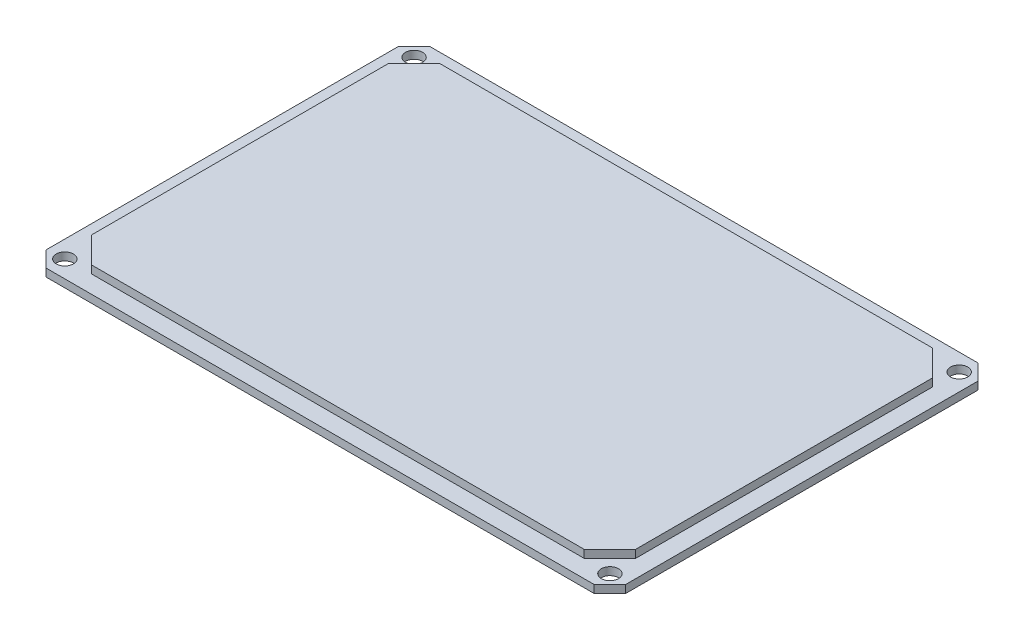
ISO-10303-21;
HEADER;
FILE_DESCRIPTION(('STEP AP214'),'2;1');
FILE_NAME('part.step','',(''),(''),'','','');
FILE_SCHEMA(('AUTOMOTIVE_DESIGN { 1 0 10303 214 1 1 1 1 }'));
ENDSEC;
DATA;
#1=APPLICATION_CONTEXT('core data for automotive mechanical design processes');
#2=APPLICATION_PROTOCOL_DEFINITION('international standard','automotive_design',2000,#1);
#3=PRODUCT_CONTEXT('',#1,'mechanical');
#4=PRODUCT('Part','Part','',(#3));
#5=PRODUCT_RELATED_PRODUCT_CATEGORY('part','',(#4));
#6=PRODUCT_DEFINITION_FORMATION('','',#4);
#7=PRODUCT_DEFINITION_CONTEXT('part definition',#1,'design');
#8=PRODUCT_DEFINITION('design','',#6,#7);
#9=PRODUCT_DEFINITION_SHAPE('','',#8);
#10=(LENGTH_UNIT() NAMED_UNIT(*) SI_UNIT(.MILLI.,.METRE.));
#11=(NAMED_UNIT(*) PLANE_ANGLE_UNIT() SI_UNIT($,.RADIAN.));
#12=(NAMED_UNIT(*) SI_UNIT($,.STERADIAN.) SOLID_ANGLE_UNIT());
#13=UNCERTAINTY_MEASURE_WITH_UNIT(LENGTH_MEASURE(1.E-05),#10,'distance_accuracy_value','');
#14=(GEOMETRIC_REPRESENTATION_CONTEXT(3) GLOBAL_UNCERTAINTY_ASSIGNED_CONTEXT((#13)) GLOBAL_UNIT_ASSIGNED_CONTEXT((#10,
#11,#12)) REPRESENTATION_CONTEXT('',''));
#15=CARTESIAN_POINT('',(0.,0.,0.));
#16=DIRECTION('',(0.,0.,1.));
#17=DIRECTION('',(1.,0.,0.));
#18=AXIS2_PLACEMENT_3D('',#15,#16,#17);
#19=CARTESIAN_POINT('',(0.,1.,0.));
#20=DIRECTION('',(0.,-1.,0.));
#21=DIRECTION('',(0.,0.,-1.));
#22=AXIS2_PLACEMENT_3D('',#19,#20,#21);
#23=PLANE('',#22);
#24=CARTESIAN_POINT('',(34.8,1.,-22.3));
#25=DIRECTION('',(0.,1.,0.));
#26=DIRECTION('',(0.,0.,1.));
#27=AXIS2_PLACEMENT_3D('',#24,#25,#26);
#28=CIRCLE('',#27,1.1);
#29=CARTESIAN_POINT('',(34.8,1.,-21.2));
#30=VERTEX_POINT('',#29);
#31=EDGE_CURVE('E366',#30,#30,#28,.T.);
#32=ORIENTED_EDGE('',*,*,#31,.F.);
#33=EDGE_LOOP('',(#32));
#34=FACE_BOUND('',#33,.T.);
#35=CARTESIAN_POINT('',(34.8,1.,22.3));
#36=DIRECTION('',(0.,1.,0.));
#37=DIRECTION('',(0.,0.,1.));
#38=AXIS2_PLACEMENT_3D('',#35,#36,#37);
#39=CIRCLE('',#38,1.1);
#40=CARTESIAN_POINT('',(34.8,1.,23.4));
#41=VERTEX_POINT('',#40);
#42=EDGE_CURVE('E372',#41,#41,#39,.T.);
#43=ORIENTED_EDGE('',*,*,#42,.F.);
#44=EDGE_LOOP('',(#43));
#45=FACE_BOUND('',#44,.T.);
#46=CARTESIAN_POINT('',(-34.8,1.,22.3));
#47=DIRECTION('',(0.,1.,0.));
#48=DIRECTION('',(0.,0.,1.));
#49=AXIS2_PLACEMENT_3D('',#46,#47,#48);
#50=CIRCLE('',#49,1.1);
#51=CARTESIAN_POINT('',(-34.8,1.,23.4));
#52=VERTEX_POINT('',#51);
#53=EDGE_CURVE('E380',#52,#52,#50,.T.);
#54=ORIENTED_EDGE('',*,*,#53,.F.);
#55=EDGE_LOOP('',(#54));
#56=FACE_BOUND('',#55,.T.);
#57=CARTESIAN_POINT('',(-34.8,1.,-22.3));
#58=DIRECTION('',(0.,1.,0.));
#59=DIRECTION('',(0.,0.,1.));
#60=AXIS2_PLACEMENT_3D('',#57,#58,#59);
#61=CIRCLE('',#60,1.1);
#62=CARTESIAN_POINT('',(-34.8,1.,-21.2));
#63=VERTEX_POINT('',#62);
#64=EDGE_CURVE('E369',#63,#63,#61,.T.);
#65=ORIENTED_EDGE('',*,*,#64,.F.);
#66=EDGE_LOOP('',(#65));
#67=FACE_BOUND('',#66,.T.);
#68=DIRECTION('',(-1.,0.,0.));
#69=VECTOR('',#68,1.);
#70=CARTESIAN_POINT('',(-37.,1.,-24.5));
#71=LINE('',#70,#69);
#72=CARTESIAN_POINT('',(35.,1.,-24.5));
#73=VERTEX_POINT('',#72);
#74=CARTESIAN_POINT('',(-35.,1.,-24.5));
#75=VERTEX_POINT('',#74);
#76=EDGE_CURVE('E281',#73,#75,#71,.T.);
#77=ORIENTED_EDGE('',*,*,#76,.T.);
#78=DIRECTION('',(0.707106781186548,0.,-0.707106781186548));
#79=VECTOR('',#78,1.);
#80=CARTESIAN_POINT('',(-37.,1.,-22.5));
#81=LINE('',#80,#79);
#82=CARTESIAN_POINT('',(-37.,1.,-22.5));
#83=VERTEX_POINT('',#82);
#84=EDGE_CURVE('E196',#75,#83,#81,.F.);
#85=ORIENTED_EDGE('',*,*,#84,.T.);
#86=DIRECTION('',(0.,0.,1.));
#87=VECTOR('',#86,1.);
#88=CARTESIAN_POINT('',(-37.,1.,24.5));
#89=LINE('',#88,#87);
#90=CARTESIAN_POINT('',(-37.,1.,22.5));
#91=VERTEX_POINT('',#90);
#92=EDGE_CURVE('E165',#83,#91,#89,.T.);
#93=ORIENTED_EDGE('',*,*,#92,.T.);
#94=DIRECTION('',(-0.707106781186548,0.,-0.707106781186548));
#95=VECTOR('',#94,1.);
#96=CARTESIAN_POINT('',(-35.,1.,24.5));
#97=LINE('',#96,#95);
#98=CARTESIAN_POINT('',(-35.,1.,24.5));
#99=VERTEX_POINT('',#98);
#100=EDGE_CURVE('E190',#91,#99,#97,.F.);
#101=ORIENTED_EDGE('',*,*,#100,.T.);
#102=DIRECTION('',(1.,0.,0.));
#103=VECTOR('',#102,1.);
#104=CARTESIAN_POINT('',(-37.,1.,24.5));
#105=LINE('',#104,#103);
#106=CARTESIAN_POINT('',(35.,1.,24.5));
#107=VERTEX_POINT('',#106);
#108=EDGE_CURVE('E181',#99,#107,#105,.T.);
#109=ORIENTED_EDGE('',*,*,#108,.T.);
#110=DIRECTION('',(-0.707106781186548,0.,0.707106781186548));
#111=VECTOR('',#110,1.);
#112=CARTESIAN_POINT('',(37.,1.,22.5));
#113=LINE('',#112,#111);
#114=CARTESIAN_POINT('',(37.,1.,22.5));
#115=VERTEX_POINT('',#114);
#116=EDGE_CURVE('E192',#107,#115,#113,.F.);
#117=ORIENTED_EDGE('',*,*,#116,.T.);
#118=DIRECTION('',(0.,0.,-1.));
#119=VECTOR('',#118,1.);
#120=CARTESIAN_POINT('',(37.,1.,24.5));
#121=LINE('',#120,#119);
#122=CARTESIAN_POINT('',(37.,1.,-22.5));
#123=VERTEX_POINT('',#122);
#124=EDGE_CURVE('E175',#115,#123,#121,.T.);
#125=ORIENTED_EDGE('',*,*,#124,.T.);
#126=DIRECTION('',(0.707106781186548,0.,0.707106781186548));
#127=VECTOR('',#126,1.);
#128=CARTESIAN_POINT('',(35.,1.,-24.5));
#129=LINE('',#128,#127);
#130=EDGE_CURVE('E194',#123,#73,#129,.F.);
#131=ORIENTED_EDGE('',*,*,#130,.T.);
#132=EDGE_LOOP('',(#77,#85,#93,#101,#109,#117,#125,#131));
#133=FACE_BOUND('',#132,.T.);
#134=DIRECTION('',(0.,0.,-1.));
#135=VECTOR('',#134,1.);
#136=CARTESIAN_POINT('',(34.75,1.,22.25));
#137=LINE('',#136,#135);
#138=CARTESIAN_POINT('',(34.75,1.,18.95));
#139=VERTEX_POINT('',#138);
#140=CARTESIAN_POINT('',(34.75,1.,-18.95));
#141=VERTEX_POINT('',#140);
#142=EDGE_CURVE('E272',#139,#141,#137,.T.);
#143=ORIENTED_EDGE('',*,*,#142,.F.);
#144=DIRECTION('',(0.707106781186548,0.,-0.707106781186548));
#145=VECTOR('',#144,1.);
#146=CARTESIAN_POINT('',(26.85,1.,26.85));
#147=LINE('',#146,#145);
#148=CARTESIAN_POINT('',(31.45,1.,22.25));
#149=VERTEX_POINT('',#148);
#150=EDGE_CURVE('E235',#139,#149,#147,.F.);
#151=ORIENTED_EDGE('',*,*,#150,.T.);
#152=DIRECTION('',(1.,0.,0.));
#153=VECTOR('',#152,1.);
#154=CARTESIAN_POINT('',(-34.75,1.,22.25));
#155=LINE('',#154,#153);
#156=CARTESIAN_POINT('',(-31.45,1.,22.25));
#157=VERTEX_POINT('',#156);
#158=EDGE_CURVE('E243',#157,#149,#155,.T.);
#159=ORIENTED_EDGE('',*,*,#158,.F.);
#160=DIRECTION('',(0.707106781186545,0.,0.70710678118655));
#161=VECTOR('',#160,1.);
#162=CARTESIAN_POINT('',(-26.8500000000001,1.,26.8499999999999));
#163=LINE('',#162,#161);
#164=CARTESIAN_POINT('',(-34.75,1.,18.95));
#165=VERTEX_POINT('',#164);
#166=EDGE_CURVE('E237',#157,#165,#163,.F.);
#167=ORIENTED_EDGE('',*,*,#166,.T.);
#168=DIRECTION('',(0.,0.,1.));
#169=VECTOR('',#168,1.);
#170=CARTESIAN_POINT('',(-34.75,1.,22.25));
#171=LINE('',#170,#169);
#172=CARTESIAN_POINT('',(-34.75,1.,-18.95));
#173=VERTEX_POINT('',#172);
#174=EDGE_CURVE('E241',#173,#165,#171,.T.);
#175=ORIENTED_EDGE('',*,*,#174,.F.);
#176=DIRECTION('',(-0.707106781186548,0.,0.707106781186548));
#177=VECTOR('',#176,1.);
#178=CARTESIAN_POINT('',(-26.85,1.,-26.85));
#179=LINE('',#178,#177);
#180=CARTESIAN_POINT('',(-31.45,1.,-22.25));
#181=VERTEX_POINT('',#180);
#182=EDGE_CURVE('E41',#173,#181,#179,.F.);
#183=ORIENTED_EDGE('',*,*,#182,.T.);
#184=DIRECTION('',(-1.,0.,0.));
#185=VECTOR('',#184,1.);
#186=CARTESIAN_POINT('',(-34.75,1.,-22.25));
#187=LINE('',#186,#185);
#188=CARTESIAN_POINT('',(31.45,1.,-22.25));
#189=VERTEX_POINT('',#188);
#190=EDGE_CURVE('E252',#189,#181,#187,.T.);
#191=ORIENTED_EDGE('',*,*,#190,.F.);
#192=DIRECTION('',(-0.707106781186546,0.,-0.707106781186549));
#193=VECTOR('',#192,1.);
#194=CARTESIAN_POINT('',(26.85,1.,-26.8499999999999));
#195=LINE('',#194,#193);
#196=EDGE_CURVE('E11',#189,#141,#195,.F.);
#197=ORIENTED_EDGE('',*,*,#196,.T.);
#198=EDGE_LOOP('',(#143,#151,#159,#167,#175,#183,#191,#197));
#199=FACE_BOUND('',#198,.T.);
#200=ADVANCED_FACE('F33',(#34,#45,#56,#67,#133,#199),#23,.F.);
#201=CARTESIAN_POINT('',(37.,1.,24.5));
#202=DIRECTION('',(-1.,0.,0.));
#203=DIRECTION('',(0.,0.,1.));
#204=AXIS2_PLACEMENT_3D('',#201,#202,#203);
#205=PLANE('',#204);
#206=DIRECTION('',(0.,0.,-1.));
#207=VECTOR('',#206,1.);
#208=CARTESIAN_POINT('',(37.,0.,24.5));
#209=LINE('',#208,#207);
#210=CARTESIAN_POINT('',(37.,0.,22.5));
#211=VERTEX_POINT('',#210);
#212=CARTESIAN_POINT('',(37.,0.,-22.5));
#213=VERTEX_POINT('',#212);
#214=EDGE_CURVE('E177',#211,#213,#209,.T.);
#215=ORIENTED_EDGE('',*,*,#214,.T.);
#216=DIRECTION('',(0.,1.,0.));
#217=VECTOR('',#216,1.);
#218=CARTESIAN_POINT('',(37.,1.,-22.5));
#219=LINE('',#218,#217);
#220=EDGE_CURVE('E201',#213,#123,#219,.T.);
#221=ORIENTED_EDGE('',*,*,#220,.T.);
#222=ORIENTED_EDGE('',*,*,#124,.F.);
#223=DIRECTION('',(0.,-1.,0.));
#224=VECTOR('',#223,1.);
#225=CARTESIAN_POINT('',(37.,1.,22.5));
#226=LINE('',#225,#224);
#227=EDGE_CURVE('E198',#115,#211,#226,.T.);
#228=ORIENTED_EDGE('',*,*,#227,.T.);
#229=EDGE_LOOP('',(#215,#221,#222,#228));
#230=FACE_BOUND('',#229,.T.);
#231=ADVANCED_FACE('F299',(#230),#205,.F.);
#232=CARTESIAN_POINT('',(-37.,1.,-24.5));
#233=DIRECTION('',(0.,0.,1.));
#234=DIRECTION('',(1.,0.,0.));
#235=AXIS2_PLACEMENT_3D('',#232,#233,#234);
#236=PLANE('',#235);
#237=DIRECTION('',(-1.,0.,0.));
#238=VECTOR('',#237,1.);
#239=CARTESIAN_POINT('',(-37.,0.,-24.5));
#240=LINE('',#239,#238);
#241=CARTESIAN_POINT('',(35.,0.,-24.5));
#242=VERTEX_POINT('',#241);
#243=CARTESIAN_POINT('',(-35.,0.,-24.5));
#244=VERTEX_POINT('',#243);
#245=EDGE_CURVE('E172',#242,#244,#240,.T.);
#246=ORIENTED_EDGE('',*,*,#245,.T.);
#247=DIRECTION('',(0.,1.,0.));
#248=VECTOR('',#247,1.);
#249=CARTESIAN_POINT('',(-35.,1.,-24.5));
#250=LINE('',#249,#248);
#251=EDGE_CURVE('E150',#244,#75,#250,.T.);
#252=ORIENTED_EDGE('',*,*,#251,.T.);
#253=ORIENTED_EDGE('',*,*,#76,.F.);
#254=DIRECTION('',(0.,-1.,0.));
#255=VECTOR('',#254,1.);
#256=CARTESIAN_POINT('',(35.,1.,-24.5));
#257=LINE('',#256,#255);
#258=EDGE_CURVE('E155',#73,#242,#257,.T.);
#259=ORIENTED_EDGE('',*,*,#258,.T.);
#260=EDGE_LOOP('',(#246,#252,#253,#259));
#261=FACE_BOUND('',#260,.T.);
#262=ADVANCED_FACE('F307',(#261),#236,.F.);
#263=CARTESIAN_POINT('',(-37.,1.,24.5));
#264=DIRECTION('',(1.,0.,0.));
#265=DIRECTION('',(0.,0.,-1.));
#266=AXIS2_PLACEMENT_3D('',#263,#264,#265);
#267=PLANE('',#266);
#268=ORIENTED_EDGE('',*,*,#92,.F.);
#269=DIRECTION('',(0.,-1.,0.));
#270=VECTOR('',#269,1.);
#271=CARTESIAN_POINT('',(-37.,1.,-22.5));
#272=LINE('',#271,#270);
#273=CARTESIAN_POINT('',(-37.,0.,-22.5));
#274=VERTEX_POINT('',#273);
#275=EDGE_CURVE('E149',#83,#274,#272,.T.);
#276=ORIENTED_EDGE('',*,*,#275,.T.);
#277=DIRECTION('',(0.,0.,1.));
#278=VECTOR('',#277,1.);
#279=CARTESIAN_POINT('',(-37.,0.,24.5));
#280=LINE('',#279,#278);
#281=CARTESIAN_POINT('',(-37.,0.,22.5));
#282=VERTEX_POINT('',#281);
#283=EDGE_CURVE('E162',#274,#282,#280,.T.);
#284=ORIENTED_EDGE('',*,*,#283,.T.);
#285=DIRECTION('',(0.,1.,0.));
#286=VECTOR('',#285,1.);
#287=CARTESIAN_POINT('',(-37.,1.,22.5));
#288=LINE('',#287,#286);
#289=EDGE_CURVE('E167',#282,#91,#288,.T.);
#290=ORIENTED_EDGE('',*,*,#289,.T.);
#291=EDGE_LOOP('',(#268,#276,#284,#290));
#292=FACE_BOUND('',#291,.T.);
#293=ADVANCED_FACE('F161',(#292),#267,.F.);
#294=CARTESIAN_POINT('',(-37.,1.,24.5));
#295=DIRECTION('',(0.,0.,-1.));
#296=DIRECTION('',(-1.,0.,0.));
#297=AXIS2_PLACEMENT_3D('',#294,#295,#296);
#298=PLANE('',#297);
#299=DIRECTION('',(1.,0.,0.));
#300=VECTOR('',#299,1.);
#301=CARTESIAN_POINT('',(-37.,0.,24.5));
#302=LINE('',#301,#300);
#303=CARTESIAN_POINT('',(-35.,0.,24.5));
#304=VERTEX_POINT('',#303);
#305=CARTESIAN_POINT('',(35.,0.,24.5));
#306=VERTEX_POINT('',#305);
#307=EDGE_CURVE('E171',#304,#306,#302,.T.);
#308=ORIENTED_EDGE('',*,*,#307,.T.);
#309=DIRECTION('',(0.,1.,0.));
#310=VECTOR('',#309,1.);
#311=CARTESIAN_POINT('',(35.,1.,24.5));
#312=LINE('',#311,#310);
#313=EDGE_CURVE('E206',#306,#107,#312,.T.);
#314=ORIENTED_EDGE('',*,*,#313,.T.);
#315=ORIENTED_EDGE('',*,*,#108,.F.);
#316=DIRECTION('',(0.,-1.,0.));
#317=VECTOR('',#316,1.);
#318=CARTESIAN_POINT('',(-35.,1.,24.5));
#319=LINE('',#318,#317);
#320=EDGE_CURVE('E203',#99,#304,#319,.T.);
#321=ORIENTED_EDGE('',*,*,#320,.T.);
#322=EDGE_LOOP('',(#308,#314,#315,#321));
#323=FACE_BOUND('',#322,.T.);
#324=ADVANCED_FACE('F310',(#323),#298,.F.);
#325=CARTESIAN_POINT('',(0.,0.,0.));
#326=DIRECTION('',(0.,-1.,0.));
#327=DIRECTION('',(0.,0.,-1.));
#328=AXIS2_PLACEMENT_3D('',#325,#326,#327);
#329=PLANE('',#328);
#330=CARTESIAN_POINT('',(34.8,0.,-22.3));
#331=DIRECTION('',(0.,1.,0.));
#332=DIRECTION('',(0.,0.,1.));
#333=AXIS2_PLACEMENT_3D('',#330,#331,#332);
#334=CIRCLE('',#333,1.1);
#335=CARTESIAN_POINT('',(34.8,0.,-21.2));
#336=VERTEX_POINT('',#335);
#337=EDGE_CURVE('E364',#336,#336,#334,.T.);
#338=ORIENTED_EDGE('',*,*,#337,.T.);
#339=EDGE_LOOP('',(#338));
#340=FACE_BOUND('',#339,.T.);
#341=CARTESIAN_POINT('',(34.8,0.,22.3));
#342=DIRECTION('',(0.,1.,0.));
#343=DIRECTION('',(0.,0.,1.));
#344=AXIS2_PLACEMENT_3D('',#341,#342,#343);
#345=CIRCLE('',#344,1.1);
#346=CARTESIAN_POINT('',(34.8,0.,23.4));
#347=VERTEX_POINT('',#346);
#348=EDGE_CURVE('E367',#347,#347,#345,.T.);
#349=ORIENTED_EDGE('',*,*,#348,.T.);
#350=EDGE_LOOP('',(#349));
#351=FACE_BOUND('',#350,.T.);
#352=CARTESIAN_POINT('',(-34.8,0.,22.3));
#353=DIRECTION('',(0.,1.,0.));
#354=DIRECTION('',(0.,0.,1.));
#355=AXIS2_PLACEMENT_3D('',#352,#353,#354);
#356=CIRCLE('',#355,1.1);
#357=CARTESIAN_POINT('',(-34.8,0.,23.4));
#358=VERTEX_POINT('',#357);
#359=EDGE_CURVE('E377',#358,#358,#356,.T.);
#360=ORIENTED_EDGE('',*,*,#359,.T.);
#361=EDGE_LOOP('',(#360));
#362=FACE_BOUND('',#361,.T.);
#363=CARTESIAN_POINT('',(-34.8,0.,-22.3));
#364=DIRECTION('',(0.,1.,0.));
#365=DIRECTION('',(0.,0.,1.));
#366=AXIS2_PLACEMENT_3D('',#363,#364,#365);
#367=CIRCLE('',#366,1.1);
#368=CARTESIAN_POINT('',(-34.8,0.,-21.2));
#369=VERTEX_POINT('',#368);
#370=EDGE_CURVE('E275',#369,#369,#367,.T.);
#371=ORIENTED_EDGE('',*,*,#370,.T.);
#372=EDGE_LOOP('',(#371));
#373=FACE_BOUND('',#372,.T.);
#374=ORIENTED_EDGE('',*,*,#283,.F.);
#375=DIRECTION('',(-0.707106781186548,0.,0.707106781186548));
#376=VECTOR('',#375,1.);
#377=CARTESIAN_POINT('',(-29.75,0.,-29.75));
#378=LINE('',#377,#376);
#379=EDGE_CURVE('E145',#274,#244,#378,.F.);
#380=ORIENTED_EDGE('',*,*,#379,.T.);
#381=ORIENTED_EDGE('',*,*,#245,.F.);
#382=DIRECTION('',(-0.707106781186548,0.,-0.707106781186548));
#383=VECTOR('',#382,1.);
#384=CARTESIAN_POINT('',(29.75,0.,-29.75));
#385=LINE('',#384,#383);
#386=EDGE_CURVE('E156',#242,#213,#385,.F.);
#387=ORIENTED_EDGE('',*,*,#386,.T.);
#388=ORIENTED_EDGE('',*,*,#214,.F.);
#389=DIRECTION('',(0.707106781186548,0.,-0.707106781186548));
#390=VECTOR('',#389,1.);
#391=CARTESIAN_POINT('',(29.75,0.,29.75));
#392=LINE('',#391,#390);
#393=EDGE_CURVE('E184',#211,#306,#392,.F.);
#394=ORIENTED_EDGE('',*,*,#393,.T.);
#395=ORIENTED_EDGE('',*,*,#307,.F.);
#396=DIRECTION('',(0.707106781186548,0.,0.707106781186548));
#397=VECTOR('',#396,1.);
#398=CARTESIAN_POINT('',(-29.75,0.,29.75));
#399=LINE('',#398,#397);
#400=EDGE_CURVE('E166',#304,#282,#399,.F.);
#401=ORIENTED_EDGE('',*,*,#400,.T.);
#402=EDGE_LOOP('',(#374,#380,#381,#387,#388,#394,#395,#401));
#403=FACE_BOUND('',#402,.T.);
#404=ADVANCED_FACE('F169',(#340,#351,#362,#373,#403),#329,.T.);
#405=CARTESIAN_POINT('',(34.75,2.,22.25));
#406=DIRECTION('',(-1.,0.,0.));
#407=DIRECTION('',(0.,0.,1.));
#408=AXIS2_PLACEMENT_3D('',#405,#406,#407);
#409=PLANE('',#408);
#410=DIRECTION('',(0.,0.,-1.));
#411=VECTOR('',#410,1.);
#412=CARTESIAN_POINT('',(34.75,2.,22.25));
#413=LINE('',#412,#411);
#414=CARTESIAN_POINT('',(34.75,2.,18.95));
#415=VERTEX_POINT('',#414);
#416=CARTESIAN_POINT('',(34.75,2.,-18.95));
#417=VERTEX_POINT('',#416);
#418=EDGE_CURVE('E278',#415,#417,#413,.T.);
#419=ORIENTED_EDGE('',*,*,#418,.F.);
#420=DIRECTION('',(0.,-1.,0.));
#421=VECTOR('',#420,1.);
#422=CARTESIAN_POINT('',(34.75,2.,18.95));
#423=LINE('',#422,#421);
#424=EDGE_CURVE('E210',#415,#139,#423,.T.);
#425=ORIENTED_EDGE('',*,*,#424,.T.);
#426=ORIENTED_EDGE('',*,*,#142,.T.);
#427=DIRECTION('',(0.,1.,0.));
#428=VECTOR('',#427,1.);
#429=CARTESIAN_POINT('',(34.75,2.,-18.95));
#430=LINE('',#429,#428);
#431=EDGE_CURVE('E208',#141,#417,#430,.T.);
#432=ORIENTED_EDGE('',*,*,#431,.T.);
#433=EDGE_LOOP('',(#419,#425,#426,#432));
#434=FACE_BOUND('',#433,.T.);
#435=ADVANCED_FACE('F317',(#434),#409,.F.);
#436=CARTESIAN_POINT('',(-34.75,2.,-22.25));
#437=DIRECTION('',(0.,0.,1.));
#438=DIRECTION('',(1.,0.,0.));
#439=AXIS2_PLACEMENT_3D('',#436,#437,#438);
#440=PLANE('',#439);
#441=ORIENTED_EDGE('',*,*,#190,.T.);
#442=DIRECTION('',(0.,1.,0.));
#443=VECTOR('',#442,1.);
#444=CARTESIAN_POINT('',(-31.45,2.,-22.25));
#445=LINE('',#444,#443);
#446=CARTESIAN_POINT('',(-31.45,2.,-22.25));
#447=VERTEX_POINT('',#446);
#448=EDGE_CURVE('E233',#181,#447,#445,.T.);
#449=ORIENTED_EDGE('',*,*,#448,.T.);
#450=DIRECTION('',(-1.,0.,0.));
#451=VECTOR('',#450,1.);
#452=CARTESIAN_POINT('',(-34.75,2.,-22.25));
#453=LINE('',#452,#451);
#454=CARTESIAN_POINT('',(31.45,2.,-22.25));
#455=VERTEX_POINT('',#454);
#456=EDGE_CURVE('E268',#455,#447,#453,.T.);
#457=ORIENTED_EDGE('',*,*,#456,.F.);
#458=DIRECTION('',(0.,-1.,0.));
#459=VECTOR('',#458,1.);
#460=CARTESIAN_POINT('',(31.45,2.,-22.25));
#461=LINE('',#460,#459);
#462=EDGE_CURVE('E231',#455,#189,#461,.T.);
#463=ORIENTED_EDGE('',*,*,#462,.T.);
#464=EDGE_LOOP('',(#441,#449,#457,#463));
#465=FACE_BOUND('',#464,.T.);
#466=ADVANCED_FACE('F333',(#465),#440,.F.);
#467=CARTESIAN_POINT('',(-34.75,2.,22.25));
#468=DIRECTION('',(1.,0.,0.));
#469=DIRECTION('',(0.,0.,-1.));
#470=AXIS2_PLACEMENT_3D('',#467,#468,#469);
#471=PLANE('',#470);
#472=ORIENTED_EDGE('',*,*,#174,.T.);
#473=DIRECTION('',(0.,1.,0.));
#474=VECTOR('',#473,1.);
#475=CARTESIAN_POINT('',(-34.75,2.,18.95));
#476=LINE('',#475,#474);
#477=CARTESIAN_POINT('',(-34.75,2.,18.95));
#478=VERTEX_POINT('',#477);
#479=EDGE_CURVE('E229',#165,#478,#476,.T.);
#480=ORIENTED_EDGE('',*,*,#479,.T.);
#481=DIRECTION('',(0.,0.,1.));
#482=VECTOR('',#481,1.);
#483=CARTESIAN_POINT('',(-34.75,2.,22.25));
#484=LINE('',#483,#482);
#485=CARTESIAN_POINT('',(-34.75,2.,-18.95));
#486=VERTEX_POINT('',#485);
#487=EDGE_CURVE('E262',#486,#478,#484,.T.);
#488=ORIENTED_EDGE('',*,*,#487,.F.);
#489=DIRECTION('',(0.,-1.,0.));
#490=VECTOR('',#489,1.);
#491=CARTESIAN_POINT('',(-34.75,2.,-18.95));
#492=LINE('',#491,#490);
#493=EDGE_CURVE('E226',#486,#173,#492,.T.);
#494=ORIENTED_EDGE('',*,*,#493,.T.);
#495=EDGE_LOOP('',(#472,#480,#488,#494));
#496=FACE_BOUND('',#495,.T.);
#497=ADVANCED_FACE('F248',(#496),#471,.F.);
#498=CARTESIAN_POINT('',(-34.75,2.,22.25));
#499=DIRECTION('',(0.,0.,-1.));
#500=DIRECTION('',(-1.,0.,0.));
#501=AXIS2_PLACEMENT_3D('',#498,#499,#500);
#502=PLANE('',#501);
#503=ORIENTED_EDGE('',*,*,#158,.T.);
#504=DIRECTION('',(0.,1.,0.));
#505=VECTOR('',#504,1.);
#506=CARTESIAN_POINT('',(31.45,2.,22.25));
#507=LINE('',#506,#505);
#508=CARTESIAN_POINT('',(31.45,2.,22.25));
#509=VERTEX_POINT('',#508);
#510=EDGE_CURVE('E216',#149,#509,#507,.T.);
#511=ORIENTED_EDGE('',*,*,#510,.T.);
#512=DIRECTION('',(1.,0.,0.));
#513=VECTOR('',#512,1.);
#514=CARTESIAN_POINT('',(-34.75,2.,22.25));
#515=LINE('',#514,#513);
#516=CARTESIAN_POINT('',(-31.45,2.,22.25));
#517=VERTEX_POINT('',#516);
#518=EDGE_CURVE('E260',#517,#509,#515,.T.);
#519=ORIENTED_EDGE('',*,*,#518,.F.);
#520=DIRECTION('',(0.,-1.,0.));
#521=VECTOR('',#520,1.);
#522=CARTESIAN_POINT('',(-31.45,2.,22.25));
#523=LINE('',#522,#521);
#524=EDGE_CURVE('E213',#517,#157,#523,.T.);
#525=ORIENTED_EDGE('',*,*,#524,.T.);
#526=EDGE_LOOP('',(#503,#511,#519,#525));
#527=FACE_BOUND('',#526,.T.);
#528=ADVANCED_FACE('F264',(#527),#502,.F.);
#529=CARTESIAN_POINT('',(0.,2.,0.));
#530=DIRECTION('',(0.,-1.,0.));
#531=DIRECTION('',(0.,0.,-1.));
#532=AXIS2_PLACEMENT_3D('',#529,#530,#531);
#533=PLANE('',#532);
#534=ORIENTED_EDGE('',*,*,#518,.T.);
#535=DIRECTION('',(-0.707106781186548,0.,0.707106781186548));
#536=VECTOR('',#535,1.);
#537=CARTESIAN_POINT('',(34.75,2.,18.95));
#538=LINE('',#537,#536);
#539=EDGE_CURVE('E224',#509,#415,#538,.F.);
#540=ORIENTED_EDGE('',*,*,#539,.T.);
#541=ORIENTED_EDGE('',*,*,#418,.T.);
#542=DIRECTION('',(0.707106781186546,0.,0.707106781186549));
#543=VECTOR('',#542,1.);
#544=CARTESIAN_POINT('',(31.45,2.,-22.25));
#545=LINE('',#544,#543);
#546=EDGE_CURVE('E218',#417,#455,#545,.F.);
#547=ORIENTED_EDGE('',*,*,#546,.T.);
#548=ORIENTED_EDGE('',*,*,#456,.T.);
#549=DIRECTION('',(0.707106781186548,0.,-0.707106781186548));
#550=VECTOR('',#549,1.);
#551=CARTESIAN_POINT('',(-34.75,2.,-18.95));
#552=LINE('',#551,#550);
#553=EDGE_CURVE('E220',#447,#486,#552,.F.);
#554=ORIENTED_EDGE('',*,*,#553,.T.);
#555=ORIENTED_EDGE('',*,*,#487,.T.);
#556=DIRECTION('',(-0.707106781186545,0.,-0.70710678118655));
#557=VECTOR('',#556,1.);
#558=CARTESIAN_POINT('',(-31.45,2.,22.25));
#559=LINE('',#558,#557);
#560=EDGE_CURVE('E222',#478,#517,#559,.F.);
#561=ORIENTED_EDGE('',*,*,#560,.T.);
#562=EDGE_LOOP('',(#534,#540,#541,#547,#548,#554,#555,#561));
#563=FACE_BOUND('',#562,.T.);
#564=ADVANCED_FACE('F259',(#563),#533,.F.);
#565=CARTESIAN_POINT('',(-37.,1.,-22.5));
#566=DIRECTION('',(0.707106781186547,0.,0.707106781186547));
#567=DIRECTION('',(0.,-1.,0.));
#568=AXIS2_PLACEMENT_3D('',#565,#566,#567);
#569=PLANE('',#568);
#570=ORIENTED_EDGE('',*,*,#84,.F.);
#571=ORIENTED_EDGE('',*,*,#251,.F.);
#572=ORIENTED_EDGE('',*,*,#379,.F.);
#573=ORIENTED_EDGE('',*,*,#275,.F.);
#574=EDGE_LOOP('',(#570,#571,#572,#573));
#575=FACE_BOUND('',#574,.T.);
#576=ADVANCED_FACE('F148',(#575),#569,.F.);
#577=CARTESIAN_POINT('',(35.,1.,-24.5));
#578=DIRECTION('',(-0.707106781186547,0.,0.707106781186547));
#579=DIRECTION('',(0.,-1.,0.));
#580=AXIS2_PLACEMENT_3D('',#577,#578,#579);
#581=PLANE('',#580);
#582=ORIENTED_EDGE('',*,*,#130,.F.);
#583=ORIENTED_EDGE('',*,*,#220,.F.);
#584=ORIENTED_EDGE('',*,*,#386,.F.);
#585=ORIENTED_EDGE('',*,*,#258,.F.);
#586=EDGE_LOOP('',(#582,#583,#584,#585));
#587=FACE_BOUND('',#586,.T.);
#588=ADVANCED_FACE('F304',(#587),#581,.F.);
#589=CARTESIAN_POINT('',(37.,1.,22.5));
#590=DIRECTION('',(-0.707106781186547,0.,-0.707106781186547));
#591=DIRECTION('',(0.,-1.,0.));
#592=AXIS2_PLACEMENT_3D('',#589,#590,#591);
#593=PLANE('',#592);
#594=ORIENTED_EDGE('',*,*,#116,.F.);
#595=ORIENTED_EDGE('',*,*,#313,.F.);
#596=ORIENTED_EDGE('',*,*,#393,.F.);
#597=ORIENTED_EDGE('',*,*,#227,.F.);
#598=EDGE_LOOP('',(#594,#595,#596,#597));
#599=FACE_BOUND('',#598,.T.);
#600=ADVANCED_FACE('F296',(#599),#593,.F.);
#601=CARTESIAN_POINT('',(-35.,1.,24.5));
#602=DIRECTION('',(0.707106781186547,0.,-0.707106781186547));
#603=DIRECTION('',(0.,-1.,0.));
#604=AXIS2_PLACEMENT_3D('',#601,#602,#603);
#605=PLANE('',#604);
#606=ORIENTED_EDGE('',*,*,#100,.F.);
#607=ORIENTED_EDGE('',*,*,#289,.F.);
#608=ORIENTED_EDGE('',*,*,#400,.F.);
#609=ORIENTED_EDGE('',*,*,#320,.F.);
#610=EDGE_LOOP('',(#606,#607,#608,#609));
#611=FACE_BOUND('',#610,.T.);
#612=ADVANCED_FACE('F309',(#611),#605,.F.);
#613=CARTESIAN_POINT('',(34.75,2.,18.95));
#614=DIRECTION('',(-0.707106781186548,0.,-0.707106781186548));
#615=DIRECTION('',(0.,-1.,0.));
#616=AXIS2_PLACEMENT_3D('',#613,#614,#615);
#617=PLANE('',#616);
#618=ORIENTED_EDGE('',*,*,#539,.F.);
#619=ORIENTED_EDGE('',*,*,#510,.F.);
#620=ORIENTED_EDGE('',*,*,#150,.F.);
#621=ORIENTED_EDGE('',*,*,#424,.F.);
#622=EDGE_LOOP('',(#618,#619,#620,#621));
#623=FACE_BOUND('',#622,.T.);
#624=ADVANCED_FACE('F404',(#623),#617,.F.);
#625=CARTESIAN_POINT('',(-31.45,2.,22.25));
#626=DIRECTION('',(0.70710678118655,0.,-0.707106781186545));
#627=DIRECTION('',(0.,-1.,0.));
#628=AXIS2_PLACEMENT_3D('',#625,#626,#627);
#629=PLANE('',#628);
#630=ORIENTED_EDGE('',*,*,#560,.F.);
#631=ORIENTED_EDGE('',*,*,#479,.F.);
#632=ORIENTED_EDGE('',*,*,#166,.F.);
#633=ORIENTED_EDGE('',*,*,#524,.F.);
#634=EDGE_LOOP('',(#630,#631,#632,#633));
#635=FACE_BOUND('',#634,.T.);
#636=ADVANCED_FACE('F255',(#635),#629,.F.);
#637=CARTESIAN_POINT('',(-34.75,2.,-18.95));
#638=DIRECTION('',(0.707106781186548,0.,0.707106781186548));
#639=DIRECTION('',(0.,-1.,0.));
#640=AXIS2_PLACEMENT_3D('',#637,#638,#639);
#641=PLANE('',#640);
#642=ORIENTED_EDGE('',*,*,#553,.F.);
#643=ORIENTED_EDGE('',*,*,#448,.F.);
#644=ORIENTED_EDGE('',*,*,#182,.F.);
#645=ORIENTED_EDGE('',*,*,#493,.F.);
#646=EDGE_LOOP('',(#642,#643,#644,#645));
#647=FACE_BOUND('',#646,.T.);
#648=ADVANCED_FACE('F394',(#647),#641,.F.);
#649=CARTESIAN_POINT('',(31.45,2.,-22.25));
#650=DIRECTION('',(-0.707106781186549,0.,0.707106781186546));
#651=DIRECTION('',(0.,-1.,0.));
#652=AXIS2_PLACEMENT_3D('',#649,#650,#651);
#653=PLANE('',#652);
#654=ORIENTED_EDGE('',*,*,#546,.F.);
#655=ORIENTED_EDGE('',*,*,#431,.F.);
#656=ORIENTED_EDGE('',*,*,#196,.F.);
#657=ORIENTED_EDGE('',*,*,#462,.F.);
#658=EDGE_LOOP('',(#654,#655,#656,#657));
#659=FACE_BOUND('',#658,.T.);
#660=ADVANCED_FACE('F35',(#659),#653,.F.);
#661=CARTESIAN_POINT('',(-34.8,0.,-22.3));
#662=DIRECTION('',(0.,1.,0.));
#663=DIRECTION('',(0.,0.,1.));
#664=AXIS2_PLACEMENT_3D('',#661,#662,#663);
#665=CYLINDRICAL_SURFACE('',#664,1.1);
#666=ORIENTED_EDGE('',*,*,#370,.F.);
#667=EDGE_LOOP('',(#666));
#668=FACE_BOUND('',#667,.T.);
#669=ORIENTED_EDGE('',*,*,#64,.T.);
#670=EDGE_LOOP('',(#669));
#671=FACE_BOUND('',#670,.T.);
#672=ADVANCED_FACE('F344',(#668,#671),#665,.F.);
#673=CARTESIAN_POINT('',(-34.8,0.,22.3));
#674=DIRECTION('',(0.,1.,0.));
#675=DIRECTION('',(0.,0.,1.));
#676=AXIS2_PLACEMENT_3D('',#673,#674,#675);
#677=CYLINDRICAL_SURFACE('',#676,1.1);
#678=ORIENTED_EDGE('',*,*,#359,.F.);
#679=EDGE_LOOP('',(#678));
#680=FACE_BOUND('',#679,.T.);
#681=ORIENTED_EDGE('',*,*,#53,.T.);
#682=EDGE_LOOP('',(#681));
#683=FACE_BOUND('',#682,.T.);
#684=ADVANCED_FACE('F347',(#680,#683),#677,.F.);
#685=CARTESIAN_POINT('',(34.8,0.,22.3));
#686=DIRECTION('',(0.,1.,0.));
#687=DIRECTION('',(0.,0.,1.));
#688=AXIS2_PLACEMENT_3D('',#685,#686,#687);
#689=CYLINDRICAL_SURFACE('',#688,1.1);
#690=ORIENTED_EDGE('',*,*,#348,.F.);
#691=EDGE_LOOP('',(#690));
#692=FACE_BOUND('',#691,.T.);
#693=ORIENTED_EDGE('',*,*,#42,.T.);
#694=EDGE_LOOP('',(#693));
#695=FACE_BOUND('',#694,.T.);
#696=ADVANCED_FACE('F351',(#692,#695),#689,.F.);
#697=CARTESIAN_POINT('',(34.8,0.,-22.3));
#698=DIRECTION('',(0.,1.,0.));
#699=DIRECTION('',(0.,0.,1.));
#700=AXIS2_PLACEMENT_3D('',#697,#698,#699);
#701=CYLINDRICAL_SURFACE('',#700,1.1);
#702=ORIENTED_EDGE('',*,*,#337,.F.);
#703=EDGE_LOOP('',(#702));
#704=FACE_BOUND('',#703,.T.);
#705=ORIENTED_EDGE('',*,*,#31,.T.);
#706=EDGE_LOOP('',(#705));
#707=FACE_BOUND('',#706,.T.);
#708=ADVANCED_FACE('F355',(#704,#707),#701,.F.);
#709=CLOSED_SHELL('',(#200,#231,#262,#293,#324,#404,#435,#466,#497,#528,#564,#576,#588,#600,
#612,#624,#636,#648,#660,#672,#684,#696,#708));
#710=MANIFOLD_SOLID_BREP('B2',#709);
#711=ADVANCED_BREP_SHAPE_REPRESENTATION('',(#18,#710),#14);
#712=SHAPE_DEFINITION_REPRESENTATION(#9,#711);
ENDSEC;
END-ISO-10303-21;
